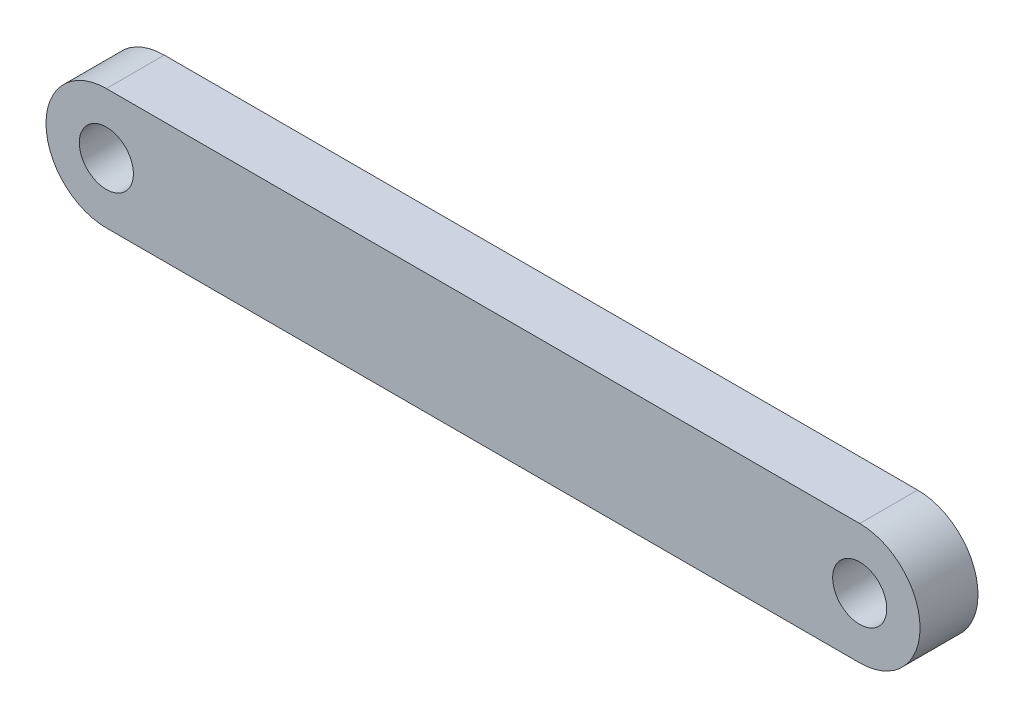
ISO-10303-21;
HEADER;
FILE_DESCRIPTION(('STEP AP214'),'2;1');
FILE_NAME('part.step','',(''),(''),'','','');
FILE_SCHEMA(('AUTOMOTIVE_DESIGN { 1 0 10303 214 1 1 1 1 }'));
ENDSEC;
DATA;
#1=APPLICATION_CONTEXT('core data for automotive mechanical design processes');
#2=APPLICATION_PROTOCOL_DEFINITION('international standard','automotive_design',2000,#1);
#3=PRODUCT_CONTEXT('',#1,'mechanical');
#4=PRODUCT('Part','Part','',(#3));
#5=PRODUCT_RELATED_PRODUCT_CATEGORY('part','',(#4));
#6=PRODUCT_DEFINITION_FORMATION('','',#4);
#7=PRODUCT_DEFINITION_CONTEXT('part definition',#1,'design');
#8=PRODUCT_DEFINITION('design','',#6,#7);
#9=PRODUCT_DEFINITION_SHAPE('','',#8);
#10=(LENGTH_UNIT() NAMED_UNIT(*) SI_UNIT(.MILLI.,.METRE.));
#11=(NAMED_UNIT(*) PLANE_ANGLE_UNIT() SI_UNIT($,.RADIAN.));
#12=(NAMED_UNIT(*) SI_UNIT($,.STERADIAN.) SOLID_ANGLE_UNIT());
#13=UNCERTAINTY_MEASURE_WITH_UNIT(LENGTH_MEASURE(1.E-05),#10,'distance_accuracy_value','');
#14=(GEOMETRIC_REPRESENTATION_CONTEXT(3) GLOBAL_UNCERTAINTY_ASSIGNED_CONTEXT((#13)) GLOBAL_UNIT_ASSIGNED_CONTEXT((#10,
#11,#12)) REPRESENTATION_CONTEXT('',''));
#15=CARTESIAN_POINT('',(0.,0.,0.));
#16=DIRECTION('',(0.,0.,1.));
#17=DIRECTION('',(1.,0.,0.));
#18=AXIS2_PLACEMENT_3D('',#15,#16,#17);
#19=CARTESIAN_POINT('',(0.,0.,3.048));
#20=DIRECTION('',(0.,0.,1.));
#21=DIRECTION('',(1.,0.,0.));
#22=AXIS2_PLACEMENT_3D('',#19,#20,#21);
#23=PLANE('',#22);
#24=CARTESIAN_POINT('',(0.,0.,3.048));
#25=DIRECTION('',(0.,0.,1.));
#26=DIRECTION('',(1.,0.,0.));
#27=AXIS2_PLACEMENT_3D('',#24,#25,#26);
#28=CIRCLE('',#27,1.4224);
#29=CARTESIAN_POINT('',(-1.4224,0.,3.048));
#30=VERTEX_POINT('',#29);
#31=EDGE_CURVE('E100',#30,#30,#28,.T.);
#32=ORIENTED_EDGE('',*,*,#31,.F.);
#33=EDGE_LOOP('',(#32));
#34=FACE_BOUND('',#33,.T.);
#35=CARTESIAN_POINT('',(0.,0.,3.048));
#36=DIRECTION('',(0.,0.,1.));
#37=DIRECTION('',(1.,0.,0.));
#38=AXIS2_PLACEMENT_3D('',#35,#36,#37);
#39=CIRCLE('',#38,3.175);
#40=CARTESIAN_POINT('',(0.,3.175,3.048));
#41=VERTEX_POINT('',#40);
#42=CARTESIAN_POINT('',(0.,-3.175,3.048));
#43=VERTEX_POINT('',#42);
#44=EDGE_CURVE('E85',#41,#43,#39,.T.);
#45=ORIENTED_EDGE('',*,*,#44,.T.);
#46=DIRECTION('',(1.,0.,0.));
#47=VECTOR('',#46,1.);
#48=CARTESIAN_POINT('',(0.,-3.175,3.048));
#49=LINE('',#48,#47);
#50=CARTESIAN_POINT('',(39.624,-3.175,3.048));
#51=VERTEX_POINT('',#50);
#52=EDGE_CURVE('E80',#43,#51,#49,.T.);
#53=ORIENTED_EDGE('',*,*,#52,.T.);
#54=CARTESIAN_POINT('',(39.624,0.,3.048));
#55=DIRECTION('',(0.,0.,1.));
#56=DIRECTION('',(1.,0.,0.));
#57=AXIS2_PLACEMENT_3D('',#54,#55,#56);
#58=CIRCLE('',#57,3.175);
#59=CARTESIAN_POINT('',(39.624,3.175,3.048));
#60=VERTEX_POINT('',#59);
#61=EDGE_CURVE('E83',#51,#60,#58,.T.);
#62=ORIENTED_EDGE('',*,*,#61,.T.);
#63=DIRECTION('',(-1.,0.,0.));
#64=VECTOR('',#63,1.);
#65=CARTESIAN_POINT('',(0.,3.175,3.048));
#66=LINE('',#65,#64);
#67=EDGE_CURVE('E50',#60,#41,#66,.T.);
#68=ORIENTED_EDGE('',*,*,#67,.T.);
#69=EDGE_LOOP('',(#45,#53,#62,#68));
#70=FACE_BOUND('',#69,.T.);
#71=CARTESIAN_POINT('',(39.624,0.,3.048));
#72=DIRECTION('',(0.,0.,1.));
#73=DIRECTION('',(1.,0.,0.));
#74=AXIS2_PLACEMENT_3D('',#71,#72,#73);
#75=CIRCLE('',#74,1.42239999999999);
#76=CARTESIAN_POINT('',(38.2016,0.,3.048));
#77=VERTEX_POINT('',#76);
#78=EDGE_CURVE('E115',#77,#77,#75,.T.);
#79=ORIENTED_EDGE('',*,*,#78,.F.);
#80=EDGE_LOOP('',(#79));
#81=FACE_BOUND('',#80,.T.);
#82=ADVANCED_FACE('F33',(#34,#70,#81),#23,.T.);
#83=CARTESIAN_POINT('',(0.,0.,0.));
#84=DIRECTION('',(0.,0.,1.));
#85=DIRECTION('',(1.,0.,0.));
#86=AXIS2_PLACEMENT_3D('',#83,#84,#85);
#87=PLANE('',#86);
#88=CARTESIAN_POINT('',(0.,0.,0.));
#89=DIRECTION('',(0.,0.,1.));
#90=DIRECTION('',(1.,0.,0.));
#91=AXIS2_PLACEMENT_3D('',#88,#89,#90);
#92=CIRCLE('',#91,1.4224);
#93=CARTESIAN_POINT('',(-1.4224,0.,0.));
#94=VERTEX_POINT('',#93);
#95=EDGE_CURVE('E112',#94,#94,#92,.T.);
#96=ORIENTED_EDGE('',*,*,#95,.T.);
#97=EDGE_LOOP('',(#96));
#98=FACE_BOUND('',#97,.T.);
#99=CARTESIAN_POINT('',(0.,0.,0.));
#100=DIRECTION('',(0.,0.,1.));
#101=DIRECTION('',(1.,0.,0.));
#102=AXIS2_PLACEMENT_3D('',#99,#100,#101);
#103=CIRCLE('',#102,3.175);
#104=CARTESIAN_POINT('',(0.,3.175,0.));
#105=VERTEX_POINT('',#104);
#106=CARTESIAN_POINT('',(0.,-3.175,0.));
#107=VERTEX_POINT('',#106);
#108=EDGE_CURVE('E97',#105,#107,#103,.T.);
#109=ORIENTED_EDGE('',*,*,#108,.F.);
#110=DIRECTION('',(-1.,0.,0.));
#111=VECTOR('',#110,1.);
#112=CARTESIAN_POINT('',(0.,3.175,0.));
#113=LINE('',#112,#111);
#114=CARTESIAN_POINT('',(39.624,3.175,0.));
#115=VERTEX_POINT('',#114);
#116=EDGE_CURVE('E73',#115,#105,#113,.T.);
#117=ORIENTED_EDGE('',*,*,#116,.F.);
#118=CARTESIAN_POINT('',(39.624,0.,0.));
#119=DIRECTION('',(0.,0.,1.));
#120=DIRECTION('',(1.,0.,0.));
#121=AXIS2_PLACEMENT_3D('',#118,#119,#120);
#122=CIRCLE('',#121,3.175);
#123=CARTESIAN_POINT('',(39.624,-3.175,0.));
#124=VERTEX_POINT('',#123);
#125=EDGE_CURVE('E67',#124,#115,#122,.T.);
#126=ORIENTED_EDGE('',*,*,#125,.F.);
#127=DIRECTION('',(1.,0.,0.));
#128=VECTOR('',#127,1.);
#129=CARTESIAN_POINT('',(0.,-3.175,0.));
#130=LINE('',#129,#128);
#131=EDGE_CURVE('E89',#107,#124,#130,.T.);
#132=ORIENTED_EDGE('',*,*,#131,.F.);
#133=EDGE_LOOP('',(#109,#117,#126,#132));
#134=FACE_BOUND('',#133,.T.);
#135=CARTESIAN_POINT('',(39.624,0.,0.));
#136=DIRECTION('',(0.,0.,1.));
#137=DIRECTION('',(1.,0.,0.));
#138=AXIS2_PLACEMENT_3D('',#135,#136,#137);
#139=CIRCLE('',#138,1.42239999999999);
#140=CARTESIAN_POINT('',(38.2016,0.,0.));
#141=VERTEX_POINT('',#140);
#142=EDGE_CURVE('E118',#141,#141,#139,.T.);
#143=ORIENTED_EDGE('',*,*,#142,.T.);
#144=EDGE_LOOP('',(#143));
#145=FACE_BOUND('',#144,.T.);
#146=ADVANCED_FACE('F108',(#98,#134,#145),#87,.F.);
#147=CARTESIAN_POINT('',(0.,0.,3.048));
#148=DIRECTION('',(0.,0.,-1.));
#149=DIRECTION('',(-1.,0.,0.));
#150=AXIS2_PLACEMENT_3D('',#147,#148,#149);
#151=CYLINDRICAL_SURFACE('',#150,3.175);
#152=ORIENTED_EDGE('',*,*,#108,.T.);
#153=DIRECTION('',(0.,0.,-1.));
#154=VECTOR('',#153,1.);
#155=CARTESIAN_POINT('',(0.,-3.175,3.048));
#156=LINE('',#155,#154);
#157=EDGE_CURVE('E11',#43,#107,#156,.T.);
#158=ORIENTED_EDGE('',*,*,#157,.F.);
#159=ORIENTED_EDGE('',*,*,#44,.F.);
#160=DIRECTION('',(0.,0.,-1.));
#161=VECTOR('',#160,1.);
#162=CARTESIAN_POINT('',(0.,3.175,3.048));
#163=LINE('',#162,#161);
#164=EDGE_CURVE('E93',#41,#105,#163,.T.);
#165=ORIENTED_EDGE('',*,*,#164,.T.);
#166=EDGE_LOOP('',(#152,#158,#159,#165));
#167=FACE_BOUND('',#166,.T.);
#168=ADVANCED_FACE('F35',(#167),#151,.T.);
#169=CARTESIAN_POINT('',(0.,-3.175,3.048));
#170=DIRECTION('',(0.,1.,0.));
#171=DIRECTION('',(-1.,0.,0.));
#172=AXIS2_PLACEMENT_3D('',#169,#170,#171);
#173=PLANE('',#172);
#174=ORIENTED_EDGE('',*,*,#131,.T.);
#175=DIRECTION('',(0.,0.,-1.));
#176=VECTOR('',#175,1.);
#177=CARTESIAN_POINT('',(39.624,-3.175,3.048));
#178=LINE('',#177,#176);
#179=EDGE_CURVE('E42',#51,#124,#178,.T.);
#180=ORIENTED_EDGE('',*,*,#179,.F.);
#181=ORIENTED_EDGE('',*,*,#52,.F.);
#182=ORIENTED_EDGE('',*,*,#157,.T.);
#183=EDGE_LOOP('',(#174,#180,#181,#182));
#184=FACE_BOUND('',#183,.T.);
#185=ADVANCED_FACE('F88',(#184),#173,.F.);
#186=CARTESIAN_POINT('',(39.624,0.,3.048));
#187=DIRECTION('',(0.,0.,-1.));
#188=DIRECTION('',(-1.,0.,0.));
#189=AXIS2_PLACEMENT_3D('',#186,#187,#188);
#190=CYLINDRICAL_SURFACE('',#189,3.175);
#191=ORIENTED_EDGE('',*,*,#125,.T.);
#192=DIRECTION('',(0.,0.,-1.));
#193=VECTOR('',#192,1.);
#194=CARTESIAN_POINT('',(39.624,3.175,3.048));
#195=LINE('',#194,#193);
#196=EDGE_CURVE('E90',#60,#115,#195,.T.);
#197=ORIENTED_EDGE('',*,*,#196,.F.);
#198=ORIENTED_EDGE('',*,*,#61,.F.);
#199=ORIENTED_EDGE('',*,*,#179,.T.);
#200=EDGE_LOOP('',(#191,#197,#198,#199));
#201=FACE_BOUND('',#200,.T.);
#202=ADVANCED_FACE('F91',(#201),#190,.T.);
#203=CARTESIAN_POINT('',(0.,3.175,3.048));
#204=DIRECTION('',(0.,-1.,0.));
#205=DIRECTION('',(1.,0.,0.));
#206=AXIS2_PLACEMENT_3D('',#203,#204,#205);
#207=PLANE('',#206);
#208=ORIENTED_EDGE('',*,*,#116,.T.);
#209=ORIENTED_EDGE('',*,*,#164,.F.);
#210=ORIENTED_EDGE('',*,*,#67,.F.);
#211=ORIENTED_EDGE('',*,*,#196,.T.);
#212=EDGE_LOOP('',(#208,#209,#210,#211));
#213=FACE_BOUND('',#212,.T.);
#214=ADVANCED_FACE('F105',(#213),#207,.F.);
#215=CARTESIAN_POINT('',(0.,0.,3.048));
#216=DIRECTION('',(0.,0.,-1.));
#217=DIRECTION('',(-1.,0.,0.));
#218=AXIS2_PLACEMENT_3D('',#215,#216,#217);
#219=CYLINDRICAL_SURFACE('',#218,1.4224);
#220=CARTESIAN_POINT('',(-1.4224,0.,3.048));
#221=CARTESIAN_POINT('',(-1.4224,0.,3.01625));
#222=CARTESIAN_POINT('',(-1.4224,0.,2.9845));
#223=CARTESIAN_POINT('',(-1.4224,0.,2.921));
#224=CARTESIAN_POINT('',(-1.4224,0.,2.88925));
#225=CARTESIAN_POINT('',(-1.4224,0.,2.82575));
#226=CARTESIAN_POINT('',(-1.4224,0.,2.794));
#227=CARTESIAN_POINT('',(-1.4224,0.,2.7305));
#228=CARTESIAN_POINT('',(-1.4224,0.,2.69875));
#229=CARTESIAN_POINT('',(-1.4224,0.,2.63525));
#230=CARTESIAN_POINT('',(-1.4224,0.,2.6035));
#231=CARTESIAN_POINT('',(-1.4224,0.,2.54));
#232=CARTESIAN_POINT('',(-1.4224,0.,2.50825));
#233=CARTESIAN_POINT('',(-1.4224,0.,2.44475));
#234=CARTESIAN_POINT('',(-1.4224,0.,2.413));
#235=CARTESIAN_POINT('',(-1.4224,0.,2.3495));
#236=CARTESIAN_POINT('',(-1.4224,0.,2.31775));
#237=CARTESIAN_POINT('',(-1.4224,0.,2.25425));
#238=CARTESIAN_POINT('',(-1.4224,0.,2.2225));
#239=CARTESIAN_POINT('',(-1.4224,0.,2.159));
#240=CARTESIAN_POINT('',(-1.4224,0.,2.12725));
#241=CARTESIAN_POINT('',(-1.4224,0.,2.06375));
#242=CARTESIAN_POINT('',(-1.4224,0.,2.032));
#243=CARTESIAN_POINT('',(-1.4224,0.,1.9685));
#244=CARTESIAN_POINT('',(-1.4224,0.,1.93675));
#245=CARTESIAN_POINT('',(-1.4224,0.,1.87325));
#246=CARTESIAN_POINT('',(-1.4224,0.,1.8415));
#247=CARTESIAN_POINT('',(-1.4224,0.,1.778));
#248=CARTESIAN_POINT('',(-1.4224,0.,1.74625));
#249=CARTESIAN_POINT('',(-1.4224,0.,1.68275));
#250=CARTESIAN_POINT('',(-1.4224,0.,1.651));
#251=CARTESIAN_POINT('',(-1.4224,0.,1.5875));
#252=CARTESIAN_POINT('',(-1.4224,0.,1.55575));
#253=CARTESIAN_POINT('',(-1.4224,0.,1.49225));
#254=CARTESIAN_POINT('',(-1.4224,0.,1.4605));
#255=CARTESIAN_POINT('',(-1.4224,0.,1.397));
#256=CARTESIAN_POINT('',(-1.4224,0.,1.36525));
#257=CARTESIAN_POINT('',(-1.4224,0.,1.30175));
#258=CARTESIAN_POINT('',(-1.4224,0.,1.27));
#259=CARTESIAN_POINT('',(-1.4224,0.,1.2065));
#260=CARTESIAN_POINT('',(-1.4224,0.,1.17475));
#261=CARTESIAN_POINT('',(-1.4224,0.,1.11125));
#262=CARTESIAN_POINT('',(-1.4224,0.,1.0795));
#263=CARTESIAN_POINT('',(-1.4224,0.,1.016));
#264=CARTESIAN_POINT('',(-1.4224,0.,0.98425));
#265=CARTESIAN_POINT('',(-1.4224,0.,0.92075));
#266=CARTESIAN_POINT('',(-1.4224,0.,0.889));
#267=CARTESIAN_POINT('',(-1.4224,0.,0.8255));
#268=CARTESIAN_POINT('',(-1.4224,0.,0.79375));
#269=CARTESIAN_POINT('',(-1.4224,0.,0.73025));
#270=CARTESIAN_POINT('',(-1.4224,0.,0.6985));
#271=CARTESIAN_POINT('',(-1.4224,0.,0.635));
#272=CARTESIAN_POINT('',(-1.4224,0.,0.60325));
#273=CARTESIAN_POINT('',(-1.4224,0.,0.53975));
#274=CARTESIAN_POINT('',(-1.4224,0.,0.508));
#275=CARTESIAN_POINT('',(-1.4224,0.,0.4445));
#276=CARTESIAN_POINT('',(-1.4224,0.,0.41275));
#277=CARTESIAN_POINT('',(-1.4224,0.,0.34925));
#278=CARTESIAN_POINT('',(-1.4224,0.,0.3175));
#279=CARTESIAN_POINT('',(-1.4224,0.,0.254));
#280=CARTESIAN_POINT('',(-1.4224,0.,0.22225));
#281=CARTESIAN_POINT('',(-1.4224,0.,0.15875));
#282=CARTESIAN_POINT('',(-1.4224,0.,0.127));
#283=CARTESIAN_POINT('',(-1.4224,0.,0.0634999999999999));
#284=CARTESIAN_POINT('',(-1.4224,0.,0.03175));
#285=CARTESIAN_POINT('',(-1.4224,0.,0.));
#286=B_SPLINE_CURVE_WITH_KNOTS('',3,(#220,#221,#222,#223,#224,#225,#226,#227,#228,#229,#230,
#231,#232,#233,#234,#235,#236,#237,#238,#239,#240,#241,#242,#243,#244,#245,#246,#247,#248,#249,
#250,#251,#252,#253,#254,#255,#256,#257,#258,#259,#260,#261,#262,#263,#264,#265,#266,#267,#268,
#269,#270,#271,#272,#273,#274,#275,#276,#277,#278,#279,#280,#281,#282,#283,#284,#285),
.UNSPECIFIED.,.F.,.F.,(4,2,2,2,2,2,2,2,2,2,2,2,2,2,2,2,2,2,2,2,2,2,2,2,2,2,2,2,2,2,2,2,4),(0.,
0.0952499999999998,0.1905,0.28575,0.381,0.47625,0.5715,0.66675,0.762,0.85725,0.9525,1.04775,
1.143,1.23825,1.3335,1.42875,1.524,1.61925,1.7145,1.80975,1.905,2.00025,2.0955,2.19075,2.286,
2.38125,2.4765,2.57175,2.667,2.76225,2.8575,2.95275,3.048),.UNSPECIFIED.);
#287=EDGE_CURVE('BSEAM136',#30,#94,#286,.T.);
#288=ORIENTED_EDGE('',*,*,#31,.T.);
#289=ORIENTED_EDGE('',*,*,#95,.F.);
#290=ORIENTED_EDGE('',*,*,#287,.T.);
#291=ORIENTED_EDGE('',*,*,#287,.F.);
#292=EDGE_LOOP('',(#288,#290,#289,#291));
#293=FACE_BOUND('',#292,.T.);
#294=ADVANCED_FACE('F136',(#293),#219,.F.);
#295=CARTESIAN_POINT('',(39.624,0.,3.048));
#296=DIRECTION('',(0.,0.,-1.));
#297=DIRECTION('',(-1.,0.,0.));
#298=AXIS2_PLACEMENT_3D('',#295,#296,#297);
#299=CYLINDRICAL_SURFACE('',#298,1.42239999999999);
#300=CARTESIAN_POINT('',(38.2016,0.,3.048));
#301=CARTESIAN_POINT('',(38.2016,0.,3.01625));
#302=CARTESIAN_POINT('',(38.2016,0.,2.9845));
#303=CARTESIAN_POINT('',(38.2016,0.,2.921));
#304=CARTESIAN_POINT('',(38.2016,0.,2.88925));
#305=CARTESIAN_POINT('',(38.2016,0.,2.82575));
#306=CARTESIAN_POINT('',(38.2016,0.,2.794));
#307=CARTESIAN_POINT('',(38.2016,0.,2.7305));
#308=CARTESIAN_POINT('',(38.2016,0.,2.69875));
#309=CARTESIAN_POINT('',(38.2016,0.,2.63525));
#310=CARTESIAN_POINT('',(38.2016,0.,2.6035));
#311=CARTESIAN_POINT('',(38.2016,0.,2.54));
#312=CARTESIAN_POINT('',(38.2016,0.,2.50825));
#313=CARTESIAN_POINT('',(38.2016,0.,2.44475));
#314=CARTESIAN_POINT('',(38.2016,0.,2.413));
#315=CARTESIAN_POINT('',(38.2016,0.,2.3495));
#316=CARTESIAN_POINT('',(38.2016,0.,2.31775));
#317=CARTESIAN_POINT('',(38.2016,0.,2.25425));
#318=CARTESIAN_POINT('',(38.2016,0.,2.2225));
#319=CARTESIAN_POINT('',(38.2016,0.,2.159));
#320=CARTESIAN_POINT('',(38.2016,0.,2.12725));
#321=CARTESIAN_POINT('',(38.2016,0.,2.06375));
#322=CARTESIAN_POINT('',(38.2016,0.,2.032));
#323=CARTESIAN_POINT('',(38.2016,0.,1.9685));
#324=CARTESIAN_POINT('',(38.2016,0.,1.93675));
#325=CARTESIAN_POINT('',(38.2016,0.,1.87325));
#326=CARTESIAN_POINT('',(38.2016,0.,1.8415));
#327=CARTESIAN_POINT('',(38.2016,0.,1.778));
#328=CARTESIAN_POINT('',(38.2016,0.,1.74625));
#329=CARTESIAN_POINT('',(38.2016,0.,1.68275));
#330=CARTESIAN_POINT('',(38.2016,0.,1.651));
#331=CARTESIAN_POINT('',(38.2016,0.,1.5875));
#332=CARTESIAN_POINT('',(38.2016,0.,1.55575));
#333=CARTESIAN_POINT('',(38.2016,0.,1.49225));
#334=CARTESIAN_POINT('',(38.2016,0.,1.4605));
#335=CARTESIAN_POINT('',(38.2016,0.,1.397));
#336=CARTESIAN_POINT('',(38.2016,0.,1.36525));
#337=CARTESIAN_POINT('',(38.2016,0.,1.30175));
#338=CARTESIAN_POINT('',(38.2016,0.,1.27));
#339=CARTESIAN_POINT('',(38.2016,0.,1.2065));
#340=CARTESIAN_POINT('',(38.2016,0.,1.17475));
#341=CARTESIAN_POINT('',(38.2016,0.,1.11125));
#342=CARTESIAN_POINT('',(38.2016,0.,1.0795));
#343=CARTESIAN_POINT('',(38.2016,0.,1.016));
#344=CARTESIAN_POINT('',(38.2016,0.,0.98425));
#345=CARTESIAN_POINT('',(38.2016,0.,0.92075));
#346=CARTESIAN_POINT('',(38.2016,0.,0.889));
#347=CARTESIAN_POINT('',(38.2016,0.,0.8255));
#348=CARTESIAN_POINT('',(38.2016,0.,0.79375));
#349=CARTESIAN_POINT('',(38.2016,0.,0.73025));
#350=CARTESIAN_POINT('',(38.2016,0.,0.6985));
#351=CARTESIAN_POINT('',(38.2016,0.,0.635));
#352=CARTESIAN_POINT('',(38.2016,0.,0.60325));
#353=CARTESIAN_POINT('',(38.2016,0.,0.53975));
#354=CARTESIAN_POINT('',(38.2016,0.,0.508));
#355=CARTESIAN_POINT('',(38.2016,0.,0.4445));
#356=CARTESIAN_POINT('',(38.2016,0.,0.41275));
#357=CARTESIAN_POINT('',(38.2016,0.,0.34925));
#358=CARTESIAN_POINT('',(38.2016,0.,0.3175));
#359=CARTESIAN_POINT('',(38.2016,0.,0.254));
#360=CARTESIAN_POINT('',(38.2016,0.,0.22225));
#361=CARTESIAN_POINT('',(38.2016,0.,0.15875));
#362=CARTESIAN_POINT('',(38.2016,0.,0.127));
#363=CARTESIAN_POINT('',(38.2016,0.,0.0634999999999999));
#364=CARTESIAN_POINT('',(38.2016,0.,0.03175));
#365=CARTESIAN_POINT('',(38.2016,0.,0.));
#366=B_SPLINE_CURVE_WITH_KNOTS('',3,(#300,#301,#302,#303,#304,#305,#306,#307,#308,#309,#310,
#311,#312,#313,#314,#315,#316,#317,#318,#319,#320,#321,#322,#323,#324,#325,#326,#327,#328,#329,
#330,#331,#332,#333,#334,#335,#336,#337,#338,#339,#340,#341,#342,#343,#344,#345,#346,#347,#348,
#349,#350,#351,#352,#353,#354,#355,#356,#357,#358,#359,#360,#361,#362,#363,#364,#365),
.UNSPECIFIED.,.F.,.F.,(4,2,2,2,2,2,2,2,2,2,2,2,2,2,2,2,2,2,2,2,2,2,2,2,2,2,2,2,2,2,2,2,4),(0.,
0.0952499999999998,0.1905,0.28575,0.381,0.47625,0.5715,0.66675,0.762,0.85725,0.9525,1.04775,
1.143,1.23825,1.3335,1.42875,1.524,1.61925,1.7145,1.80975,1.905,2.00025,2.0955,2.19075,2.286,
2.38125,2.4765,2.57175,2.667,2.76225,2.8575,2.95275,3.048),.UNSPECIFIED.);
#367=EDGE_CURVE('BSEAM124',#77,#141,#366,.T.);
#368=ORIENTED_EDGE('',*,*,#78,.T.);
#369=ORIENTED_EDGE('',*,*,#142,.F.);
#370=ORIENTED_EDGE('',*,*,#367,.T.);
#371=ORIENTED_EDGE('',*,*,#367,.F.);
#372=EDGE_LOOP('',(#368,#370,#369,#371));
#373=FACE_BOUND('',#372,.T.);
#374=ADVANCED_FACE('F124',(#373),#299,.F.);
#375=CLOSED_SHELL('',(#82,#146,#168,#185,#202,#214,#294,#374));
#376=MANIFOLD_SOLID_BREP('B2',#375);
#377=ADVANCED_BREP_SHAPE_REPRESENTATION('',(#18,#376),#14);
#378=SHAPE_DEFINITION_REPRESENTATION(#9,#377);
ENDSEC;
END-ISO-10303-21;
